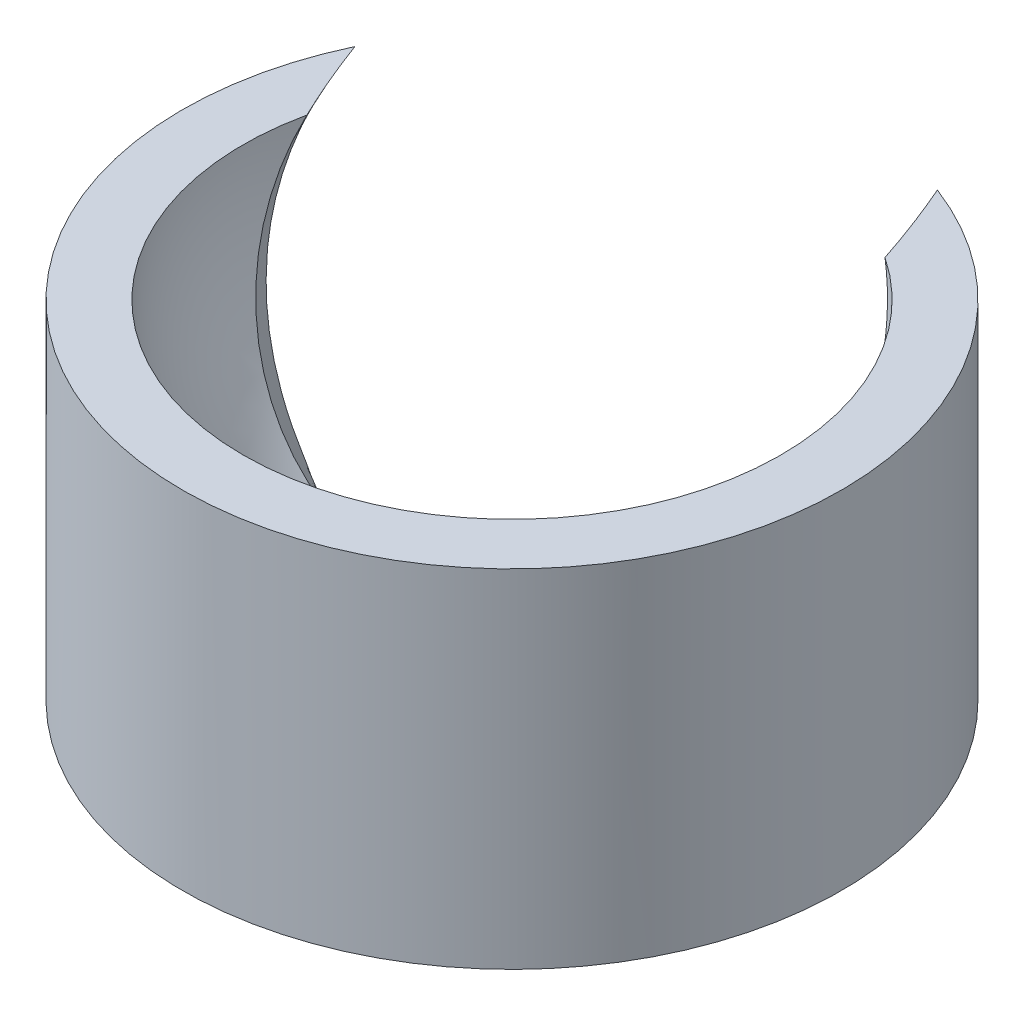
ISO-10303-21;
HEADER;
FILE_DESCRIPTION(('STEP AP214'),'2;1');
FILE_NAME('part.step','',(''),(''),'','','');
FILE_SCHEMA(('AUTOMOTIVE_DESIGN { 1 0 10303 214 1 1 1 1 }'));
ENDSEC;
DATA;
#1=APPLICATION_CONTEXT('core data for automotive mechanical design processes');
#2=APPLICATION_PROTOCOL_DEFINITION('international standard','automotive_design',2000,#1);
#3=PRODUCT_CONTEXT('',#1,'mechanical');
#4=PRODUCT('Part','Part','',(#3));
#5=PRODUCT_RELATED_PRODUCT_CATEGORY('part','',(#4));
#6=PRODUCT_DEFINITION_FORMATION('','',#4);
#7=PRODUCT_DEFINITION_CONTEXT('part definition',#1,'design');
#8=PRODUCT_DEFINITION('design','',#6,#7);
#9=PRODUCT_DEFINITION_SHAPE('','',#8);
#10=(LENGTH_UNIT() NAMED_UNIT(*) SI_UNIT(.MILLI.,.METRE.));
#11=(NAMED_UNIT(*) PLANE_ANGLE_UNIT() SI_UNIT($,.RADIAN.));
#12=(NAMED_UNIT(*) SI_UNIT($,.STERADIAN.) SOLID_ANGLE_UNIT());
#13=UNCERTAINTY_MEASURE_WITH_UNIT(LENGTH_MEASURE(1.E-05),#10,'distance_accuracy_value','');
#14=(GEOMETRIC_REPRESENTATION_CONTEXT(3) GLOBAL_UNCERTAINTY_ASSIGNED_CONTEXT((#13)) GLOBAL_UNIT_ASSIGNED_CONTEXT((#10,
#11,#12)) REPRESENTATION_CONTEXT('',''));
#15=CARTESIAN_POINT('',(0.,0.,0.));
#16=DIRECTION('',(0.,0.,1.));
#17=DIRECTION('',(1.,0.,0.));
#18=AXIS2_PLACEMENT_3D('',#15,#16,#17);
#19=CARTESIAN_POINT('',(-56.2916512459885,97.7,30.));
#20=DIRECTION('',(0.,-1.,0.));
#21=DIRECTION('',(0.,0.,1.));
#22=AXIS2_PLACEMENT_3D('',#19,#20,#21);
#23=CYLINDRICAL_SURFACE('',#22,3.8);
#24=CARTESIAN_POINT('',(-56.2916512459885,97.,30.));
#25=DIRECTION('',(0.,-1.,0.));
#26=DIRECTION('',(0.,0.,-1.));
#27=AXIS2_PLACEMENT_3D('',#24,#25,#26);
#28=CIRCLE('',#27,3.8);
#29=CARTESIAN_POINT('',(-54.5328304369495,97.,26.6315360530813));
#30=VERTEX_POINT('',#29);
#31=CARTESIAN_POINT('',(-59.8926135009129,97.,28.7862987028886));
#32=VERTEX_POINT('',#31);
#33=EDGE_CURVE('E47',#30,#32,#28,.T.);
#34=ORIENTED_EDGE('',*,*,#33,.F.);
#35=CARTESIAN_POINT('',(-54.9361596697651,101.0002,26.4499799174107));
#36=CARTESIAN_POINT('',(-54.8844101487378,100.941314470494,26.4697324113325));
#37=CARTESIAN_POINT('',(-54.8351577751465,100.880334472737,26.489841643348));
#38=CARTESIAN_POINT('',(-54.7419776648878,100.754374278326,26.5299750032429));
#39=CARTESIAN_POINT('',(-54.6980518318024,100.689392664025,26.5499990982438));
#40=CARTESIAN_POINT('',(-54.6161271243733,100.556042110918,26.5890365880717));
#41=CARTESIAN_POINT('',(-54.5780958340019,100.487694636403,26.6080551018866));
#42=CARTESIAN_POINT('',(-54.5078999745482,100.347645833791,26.6444382487657));
#43=CARTESIAN_POINT('',(-54.4757341804233,100.275945209957,26.6618032268174));
#44=CARTESIAN_POINT('',(-54.4172674795637,100.129422236479,26.6942762593181));
#45=CARTESIAN_POINT('',(-54.3909855442771,100.054590686642,26.7093769627738));
#46=CARTESIAN_POINT('',(-54.3443432373264,99.9025749564758,26.7367617070259));
#47=CARTESIAN_POINT('',(-54.3239852236582,99.8253898527917,26.7490446258025));
#48=CARTESIAN_POINT('',(-54.2889812610416,99.6693551529714,26.770489959704));
#49=CARTESIAN_POINT('',(-54.2743327464445,99.5905063212864,26.7796537762088));
#50=CARTESIAN_POINT('',(-54.2503659655614,99.4316928256814,26.7947929120763));
#51=CARTESIAN_POINT('',(-54.2410492940395,99.3517278352348,26.8007672774323));
#52=CARTESIAN_POINT('',(-54.2243226830078,99.1563821489884,26.811536098311));
#53=CARTESIAN_POINT('',(-54.219493494858,99.0406874090679,26.8146941981381));
#54=CARTESIAN_POINT('',(-54.2184945209268,98.8092431130936,26.8153475694749));
#55=CARTESIAN_POINT('',(-54.2223297957012,98.6934935645023,26.8128395316271));
#56=CARTESIAN_POINT('',(-54.2374296526581,98.4621048722978,26.8030871024966));
#57=CARTESIAN_POINT('',(-54.2487328437688,98.3464694469416,26.7958180988484));
#58=CARTESIAN_POINT('',(-54.2777516186852,98.1163673648676,26.777500993584));
#59=CARTESIAN_POINT('',(-54.2954657622457,98.001900451573,26.7664537407966));
#60=CARTESIAN_POINT('',(-54.3432810854946,97.7367003729433,26.7373517485648));
#61=CARTESIAN_POINT('',(-54.3755411453039,97.5864778116716,26.718187679508));
#62=CARTESIAN_POINT('',(-54.4301951562732,97.3639688517672,26.6870836987032));
#63=CARTESIAN_POINT('',(-54.449331738521,97.2906762454686,26.6763896508338));
#64=CARTESIAN_POINT('',(-54.4896215609705,97.14474722216,26.6543735886725));
#65=CARTESIAN_POINT('',(-54.5107746668953,97.0721107618106,26.6430516162139));
#66=CARTESIAN_POINT('',(-54.5328916156796,96.9998,26.6315041097256));
#67=B_SPLINE_CURVE_WITH_KNOTS('',3,(#35,#36,#37,#38,#39,#40,#41,#42,#43,#44,#45,#46,#47,#48,#49,
#50,#51,#52,#53,#54,#55,#56,#57,#58,#59,#60,#61,#62,#63,#64,#65,#66),.UNSPECIFIED.,.F.,.F.,(4,2,
2,2,2,2,2,2,2,2,2,2,2,2,2,4),(0.,0.242487812446091,0.485062030598377,0.726250914982047,
0.967389367841494,1.2092944754156,1.4512957411489,1.69318813428321,1.93515284012404,
2.28209096716263,2.62923177885385,2.97818149210642,3.32705286107756,3.79116730720974,
4.02064608070599,4.25010958426818),.UNSPECIFIED.);
#68=CARTESIAN_POINT('',(-54.9359840099452,101.,26.4500469939563));
#69=VERTEX_POINT('',#68);
#70=EDGE_CURVE('E100',#69,#30,#67,.T.);
#71=ORIENTED_EDGE('',*,*,#70,.F.);
#72=CARTESIAN_POINT('',(-56.2916512459885,101.,30.));
#73=DIRECTION('',(0.,-1.,0.));
#74=DIRECTION('',(0.,0.,-1.));
#75=AXIS2_PLACEMENT_3D('',#72,#73,#74);
#76=CIRCLE('',#75,3.8);
#77=CARTESIAN_POINT('',(-59.7272686237187,101.,28.3762594930721));
#78=VERTEX_POINT('',#77);
#79=EDGE_CURVE('E84',#69,#78,#76,.T.);
#80=ORIENTED_EDGE('',*,*,#79,.T.);
#81=CARTESIAN_POINT('',(-59.8925914569327,96.9998,28.786233301987));
#82=CARTESIAN_POINT('',(-59.9003894789123,97.0705546747354,28.8093674630436));
#83=CARTESIAN_POINT('',(-59.9076711048667,97.1416227927385,28.8317076234368));
#84=CARTESIAN_POINT('',(-59.9212568364274,97.2843968994103,28.8746246034395));
#85=CARTESIAN_POINT('',(-59.9275607496952,97.3561030106608,28.8952010757355));
#86=CARTESIAN_POINT('',(-59.9451300673006,97.5727136817751,28.9541612611767));
#87=CARTESIAN_POINT('',(-59.9549931284428,97.7185595063866,28.9895927121675));
#88=CARTESIAN_POINT('',(-59.9714710949708,98.0158920594204,29.0513319027936));
#89=CARTESIAN_POINT('',(-59.9780061107234,98.1674313864205,29.0774111569784));
#90=CARTESIAN_POINT('',(-59.9875575161809,98.4721704684842,29.1164270389066));
#91=CARTESIAN_POINT('',(-59.9905799099917,98.6253669371333,29.1293860880443));
#92=CARTESIAN_POINT('',(-59.9922924003672,98.8659999089151,29.1367203096097));
#93=CARTESIAN_POINT('',(-59.9922897724835,98.9532633070037,29.1367042786355));
#94=CARTESIAN_POINT('',(-59.9908736721881,99.1275942839115,29.1306509542962));
#95=CARTESIAN_POINT('',(-59.9894601617542,99.21466185739,29.1246134986582));
#96=CARTESIAN_POINT('',(-59.9849959187456,99.3874862827804,29.1059660787108));
#97=CARTESIAN_POINT('',(-59.9819559696164,99.473247984399,29.093399419327));
#98=CARTESIAN_POINT('',(-59.9739162279926,99.6433678720104,29.0612778618108));
#99=CARTESIAN_POINT('',(-59.9689165989618,99.727726174454,29.0417235465552));
#100=CARTESIAN_POINT('',(-59.9564748565576,99.8952399752276,28.9951845779482));
#101=CARTESIAN_POINT('',(-59.9490054809198,99.9783707074235,28.9681175569696));
#102=CARTESIAN_POINT('',(-59.9311531164198,100.141642311545,28.9068198586489));
#103=CARTESIAN_POINT('',(-59.9207697273455,100.22178277107,28.8725881974758));
#104=CARTESIAN_POINT('',(-59.8965720338857,100.378437216735,28.7974599044711));
#105=CARTESIAN_POINT('',(-59.8827540783681,100.454947239775,28.756556195898));
#106=CARTESIAN_POINT('',(-59.8512121144113,100.603678553575,28.6689518838892));
#107=CARTESIAN_POINT('',(-59.8334899573245,100.675901856538,28.6222540325753));
#108=CARTESIAN_POINT('',(-59.800983700861,100.790159616009,28.5420167824031));
#109=CARTESIAN_POINT('',(-59.7874928121077,100.83358075225,28.50990543231));
#110=CARTESIAN_POINT('',(-59.7587143087419,100.918387540099,28.4441203188567));
#111=CARTESIAN_POINT('',(-59.7434320968312,100.959778804244,28.4104514300198));
#112=CARTESIAN_POINT('',(-59.727188273866,101.0002,28.3760894944355));
#113=B_SPLINE_CURVE_WITH_KNOTS('',3,(#81,#82,#83,#84,#85,#86,#87,#88,#89,#90,#91,#92,#93,#94,
#95,#96,#97,#98,#99,#100,#101,#102,#103,#104,#105,#106,#107,#108,#109,#110,#111,#112),
.UNSPECIFIED.,.F.,.F.,(4,2,2,2,2,2,2,2,2,2,2,2,2,2,2,4),(0.,0.224529608607502,0.449103331512417,
0.899999438099021,1.36126182999431,1.82173462355424,2.08334352968175,2.34495948616094,
2.60486201655757,2.86474287218572,3.12759392537994,3.39048109634731,3.65364893503418,
3.91669224847531,4.08360469898819,4.25002609611647),.UNSPECIFIED.);
#114=EDGE_CURVE('E78',#32,#78,#113,.T.);
#115=ORIENTED_EDGE('',*,*,#114,.F.);
#116=EDGE_LOOP('',(#34,#71,#80,#115));
#117=FACE_BOUND('',#116,.T.);
#118=ADVANCED_FACE('F41',(#117),#23,.T.);
#119=CARTESIAN_POINT('',(-56.2916512459885,97.,30.));
#120=DIRECTION('',(0.,1.,0.));
#121=DIRECTION('',(0.,0.,-1.));
#122=AXIS2_PLACEMENT_3D('',#119,#120,#121);
#123=PLANE('',#122);
#124=ORIENTED_EDGE('',*,*,#33,.T.);
#125=CARTESIAN_POINT('',(-60.4195676971179,97.,19.7321699509699));
#126=DIRECTION('',(0.,-1.,0.));
#127=DIRECTION('',(-0.373009193509687,0.,-0.927827646471721));
#128=AXIS2_PLACEMENT_3D('',#125,#126,#127);
#129=ELLIPSE('',#128,10.5033012386468,5.02786274995615);
#130=EDGE_CURVE('E62',#30,#32,#129,.T.);
#131=ORIENTED_EDGE('',*,*,#130,.F.);
#132=EDGE_LOOP('',(#124,#131));
#133=FACE_BOUND('',#132,.T.);
#134=ADVANCED_FACE('F108',(#133),#123,.F.);
#135=CARTESIAN_POINT('',(-56.2916512459885,101.,30.));
#136=DIRECTION('',(0.,1.,0.));
#137=DIRECTION('',(0.,0.,-1.));
#138=AXIS2_PLACEMENT_3D('',#135,#136,#137);
#139=PLANE('',#138);
#140=CARTESIAN_POINT('',(-57.2135245359946,101.,27.7069210628203));
#141=DIRECTION('',(0.,-1.,0.));
#142=DIRECTION('',(-0.373009193509687,0.,-0.927827646471721));
#143=AXIS2_PLACEMENT_3D('',#140,#141,#142);
#144=ELLIPSE('',#143,5.40311255334577,2.58643522865269);
#145=CARTESIAN_POINT('',(-54.5642688393494,101.,27.4258690745742));
#146=VERTEX_POINT('',#145);
#147=EDGE_CURVE('E85',#69,#146,#144,.T.);
#148=ORIENTED_EDGE('',*,*,#147,.T.);
#149=CARTESIAN_POINT('',(-56.2916512459885,101.,30.));
#150=DIRECTION('',(0.,-1.,0.));
#151=DIRECTION('',(0.,0.,-1.));
#152=AXIS2_PLACEMENT_3D('',#149,#150,#151);
#153=CIRCLE('',#152,3.1);
#154=CARTESIAN_POINT('',(-59.3201048785821,101.,29.3378303878681));
#155=VERTEX_POINT('',#154);
#156=EDGE_CURVE('E74',#146,#155,#153,.T.);
#157=ORIENTED_EDGE('',*,*,#156,.T.);
#158=EDGE_CURVE('E77',#155,#78,#144,.T.);
#159=ORIENTED_EDGE('',*,*,#158,.T.);
#160=ORIENTED_EDGE('',*,*,#79,.F.);
#161=EDGE_LOOP('',(#148,#157,#159,#160));
#162=FACE_BOUND('',#161,.T.);
#163=ADVANCED_FACE('F83',(#162),#139,.T.);
#164=CARTESIAN_POINT('',(-56.2916512459885,101.,30.));
#165=DIRECTION('',(0.,0.,-1.));
#166=DIRECTION('',(-1.,0.,0.));
#167=AXIS2_PLACEMENT_3D('',#164,#165,#166);
#168=SPHERICAL_SURFACE('',#167,3.1);
#169=ORIENTED_EDGE('',*,*,#156,.F.);
#170=CARTESIAN_POINT('',(-56.7536771150602,100.208810505388,28.8507511820919));
#171=DIRECTION('',(-0.314352663124664,-0.538308656109163,-0.781924672807028));
#172=DIRECTION('',(0.,0.823680084758126,-0.567054775108055));
#173=AXIS2_PLACEMENT_3D('',#170,#171,#172);
#174=CIRCLE('',#173,2.72942822482299);
#175=EDGE_CURVE('E11',#155,#146,#174,.F.);
#176=ORIENTED_EDGE('',*,*,#175,.F.);
#177=EDGE_LOOP('',(#169,#176));
#178=FACE_BOUND('',#177,.T.);
#179=ADVANCED_FACE('F75',(#178),#168,.F.);
#180=CARTESIAN_POINT('',(-56.2916512459885,101.,30.));
#181=DIRECTION('',(-0.314352663124664,-0.538308656109163,-0.781924672807028));
#182=DIRECTION('',(0.,-0.823680084758126,0.567054775108055));
#183=AXIS2_PLACEMENT_3D('',#180,#181,#182);
#184=CONICAL_SURFACE('',#183,2.30000000000002,0.284261523704202);
#185=ORIENTED_EDGE('',*,*,#70,.T.);
#186=ORIENTED_EDGE('',*,*,#130,.T.);
#187=ORIENTED_EDGE('',*,*,#114,.T.);
#188=ORIENTED_EDGE('',*,*,#158,.F.);
#189=ORIENTED_EDGE('',*,*,#175,.T.);
#190=ORIENTED_EDGE('',*,*,#147,.F.);
#191=EDGE_LOOP('',(#185,#186,#187,#188,#189,#190));
#192=FACE_BOUND('',#191,.T.);
#193=ADVANCED_FACE('F80',(#192),#184,.F.);
#194=CLOSED_SHELL('',(#118,#134,#163,#179,#193));
#195=MANIFOLD_SOLID_BREP('B2',#194);
#196=ADVANCED_BREP_SHAPE_REPRESENTATION('',(#18,#195),#14);
#197=SHAPE_DEFINITION_REPRESENTATION(#9,#196);
ENDSEC;
END-ISO-10303-21;
